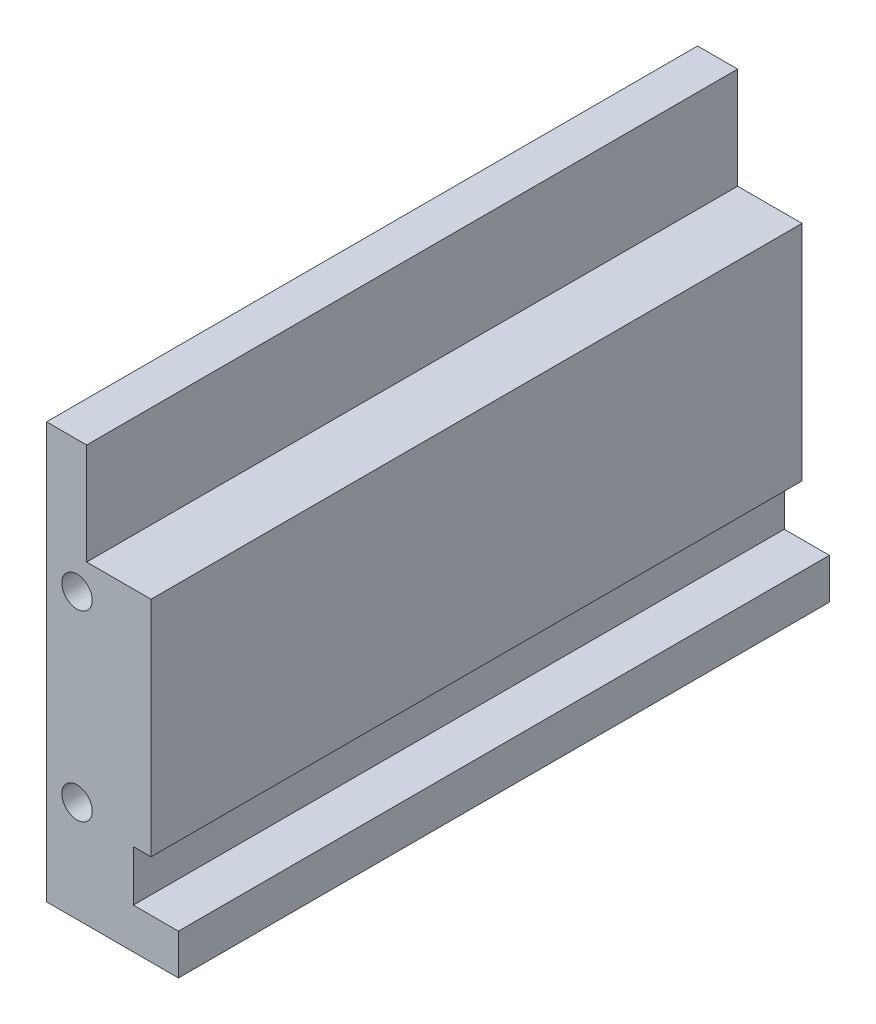
ISO-10303-21;
HEADER;
FILE_DESCRIPTION(('STEP AP214'),'2;1');
FILE_NAME('part.step','',(''),(''),'','','');
FILE_SCHEMA(('AUTOMOTIVE_DESIGN { 1 0 10303 214 1 1 1 1 }'));
ENDSEC;
DATA;
#1=APPLICATION_CONTEXT('core data for automotive mechanical design processes');
#2=APPLICATION_PROTOCOL_DEFINITION('international standard','automotive_design',2000,#1);
#3=PRODUCT_CONTEXT('',#1,'mechanical');
#4=PRODUCT('Part','Part','',(#3));
#5=PRODUCT_RELATED_PRODUCT_CATEGORY('part','',(#4));
#6=PRODUCT_DEFINITION_FORMATION('','',#4);
#7=PRODUCT_DEFINITION_CONTEXT('part definition',#1,'design');
#8=PRODUCT_DEFINITION('design','',#6,#7);
#9=PRODUCT_DEFINITION_SHAPE('','',#8);
#10=(LENGTH_UNIT() NAMED_UNIT(*) SI_UNIT(.MILLI.,.METRE.));
#11=(NAMED_UNIT(*) PLANE_ANGLE_UNIT() SI_UNIT($,.RADIAN.));
#12=(NAMED_UNIT(*) SI_UNIT($,.STERADIAN.) SOLID_ANGLE_UNIT());
#13=UNCERTAINTY_MEASURE_WITH_UNIT(LENGTH_MEASURE(1.E-05),#10,'distance_accuracy_value','');
#14=(GEOMETRIC_REPRESENTATION_CONTEXT(3) GLOBAL_UNCERTAINTY_ASSIGNED_CONTEXT((#13)) GLOBAL_UNIT_ASSIGNED_CONTEXT((#10,
#11,#12)) REPRESENTATION_CONTEXT('',''));
#15=CARTESIAN_POINT('',(0.,0.,0.));
#16=DIRECTION('',(0.,0.,1.));
#17=DIRECTION('',(1.,0.,0.));
#18=AXIS2_PLACEMENT_3D('',#15,#16,#17);
#19=CARTESIAN_POINT('',(13.,0.,64.2));
#20=DIRECTION('',(0.,1.,0.));
#21=DIRECTION('',(-1.,0.,0.));
#22=AXIS2_PLACEMENT_3D('',#19,#20,#21);
#23=PLANE('',#22);
#24=DIRECTION('',(1.,0.,0.));
#25=VECTOR('',#24,1.);
#26=CARTESIAN_POINT('',(13.,0.,0.));
#27=LINE('',#26,#25);
#28=CARTESIAN_POINT('',(0.,0.,0.));
#29=VERTEX_POINT('',#28);
#30=CARTESIAN_POINT('',(13.,0.,0.));
#31=VERTEX_POINT('',#30);
#32=EDGE_CURVE('E151',#29,#31,#27,.T.);
#33=ORIENTED_EDGE('',*,*,#32,.T.);
#34=DIRECTION('',(0.,0.,-1.));
#35=VECTOR('',#34,1.);
#36=CARTESIAN_POINT('',(13.,0.,64.2));
#37=LINE('',#36,#35);
#38=CARTESIAN_POINT('',(13.,0.,64.2));
#39=VERTEX_POINT('',#38);
#40=EDGE_CURVE('E11',#39,#31,#37,.T.);
#41=ORIENTED_EDGE('',*,*,#40,.F.);
#42=DIRECTION('',(1.,0.,0.));
#43=VECTOR('',#42,1.);
#44=CARTESIAN_POINT('',(13.,0.,64.2));
#45=LINE('',#44,#43);
#46=CARTESIAN_POINT('',(0.,0.,64.2));
#47=VERTEX_POINT('',#46);
#48=EDGE_CURVE('E180',#47,#39,#45,.T.);
#49=ORIENTED_EDGE('',*,*,#48,.F.);
#50=DIRECTION('',(0.,0.,-1.));
#51=VECTOR('',#50,1.);
#52=CARTESIAN_POINT('',(0.,0.,64.2));
#53=LINE('',#52,#51);
#54=EDGE_CURVE('E147',#47,#29,#53,.T.);
#55=ORIENTED_EDGE('',*,*,#54,.T.);
#56=EDGE_LOOP('',(#33,#41,#49,#55));
#57=FACE_BOUND('',#56,.T.);
#58=ADVANCED_FACE('F38',(#57),#23,.F.);
#59=CARTESIAN_POINT('',(13.,4.,64.2));
#60=DIRECTION('',(-1.,0.,0.));
#61=DIRECTION('',(0.,-1.,0.));
#62=AXIS2_PLACEMENT_3D('',#59,#60,#61);
#63=PLANE('',#62);
#64=DIRECTION('',(0.,1.,0.));
#65=VECTOR('',#64,1.);
#66=CARTESIAN_POINT('',(13.,4.,0.));
#67=LINE('',#66,#65);
#68=CARTESIAN_POINT('',(13.,4.,0.));
#69=VERTEX_POINT('',#68);
#70=EDGE_CURVE('E155',#31,#69,#67,.T.);
#71=ORIENTED_EDGE('',*,*,#70,.T.);
#72=DIRECTION('',(0.,0.,-1.));
#73=VECTOR('',#72,1.);
#74=CARTESIAN_POINT('',(13.,4.,64.2));
#75=LINE('',#74,#73);
#76=CARTESIAN_POINT('',(13.,4.,64.2));
#77=VERTEX_POINT('',#76);
#78=EDGE_CURVE('E47',#77,#69,#75,.T.);
#79=ORIENTED_EDGE('',*,*,#78,.F.);
#80=DIRECTION('',(0.,1.,0.));
#81=VECTOR('',#80,1.);
#82=CARTESIAN_POINT('',(13.,4.,64.2));
#83=LINE('',#82,#81);
#84=EDGE_CURVE('E104',#39,#77,#83,.T.);
#85=ORIENTED_EDGE('',*,*,#84,.F.);
#86=ORIENTED_EDGE('',*,*,#40,.T.);
#87=EDGE_LOOP('',(#71,#79,#85,#86));
#88=FACE_BOUND('',#87,.T.);
#89=ADVANCED_FACE('F286',(#88),#63,.F.);
#90=CARTESIAN_POINT('',(8.55,4.,64.2));
#91=DIRECTION('',(0.,-1.,0.));
#92=DIRECTION('',(1.,0.,0.));
#93=AXIS2_PLACEMENT_3D('',#90,#91,#92);
#94=PLANE('',#93);
#95=DIRECTION('',(-1.,0.,0.));
#96=VECTOR('',#95,1.);
#97=CARTESIAN_POINT('',(8.55,4.,0.));
#98=LINE('',#97,#96);
#99=CARTESIAN_POINT('',(8.55,4.,0.));
#100=VERTEX_POINT('',#99);
#101=EDGE_CURVE('E159',#69,#100,#98,.T.);
#102=ORIENTED_EDGE('',*,*,#101,.T.);
#103=DIRECTION('',(0.,0.,-1.));
#104=VECTOR('',#103,1.);
#105=CARTESIAN_POINT('',(8.55,4.,64.2));
#106=LINE('',#105,#104);
#107=CARTESIAN_POINT('',(8.55,4.,64.2));
#108=VERTEX_POINT('',#107);
#109=EDGE_CURVE('E199',#108,#100,#106,.T.);
#110=ORIENTED_EDGE('',*,*,#109,.F.);
#111=DIRECTION('',(-1.,0.,0.));
#112=VECTOR('',#111,1.);
#113=CARTESIAN_POINT('',(8.55,4.,64.2));
#114=LINE('',#113,#112);
#115=EDGE_CURVE('E209',#77,#108,#114,.T.);
#116=ORIENTED_EDGE('',*,*,#115,.F.);
#117=ORIENTED_EDGE('',*,*,#78,.T.);
#118=EDGE_LOOP('',(#102,#110,#116,#117));
#119=FACE_BOUND('',#118,.T.);
#120=ADVANCED_FACE('F207',(#119),#94,.F.);
#121=CARTESIAN_POINT('',(8.55,9.,64.2));
#122=DIRECTION('',(-1.,0.,0.));
#123=DIRECTION('',(0.,0.,1.));
#124=AXIS2_PLACEMENT_3D('',#121,#122,#123);
#125=PLANE('',#124);
#126=DIRECTION('',(0.,1.,0.));
#127=VECTOR('',#126,1.);
#128=CARTESIAN_POINT('',(8.55,9.,0.));
#129=LINE('',#128,#127);
#130=CARTESIAN_POINT('',(8.55,9.,0.));
#131=VERTEX_POINT('',#130);
#132=EDGE_CURVE('E162',#100,#131,#129,.T.);
#133=ORIENTED_EDGE('',*,*,#132,.T.);
#134=DIRECTION('',(0.,0.,-1.));
#135=VECTOR('',#134,1.);
#136=CARTESIAN_POINT('',(8.55,9.,64.2));
#137=LINE('',#136,#135);
#138=CARTESIAN_POINT('',(8.55,9.,64.2));
#139=VERTEX_POINT('',#138);
#140=EDGE_CURVE('E195',#139,#131,#137,.T.);
#141=ORIENTED_EDGE('',*,*,#140,.F.);
#142=DIRECTION('',(0.,1.,0.));
#143=VECTOR('',#142,1.);
#144=CARTESIAN_POINT('',(8.55,9.,64.2));
#145=LINE('',#144,#143);
#146=EDGE_CURVE('E228',#108,#139,#145,.T.);
#147=ORIENTED_EDGE('',*,*,#146,.F.);
#148=ORIENTED_EDGE('',*,*,#109,.T.);
#149=EDGE_LOOP('',(#133,#141,#147,#148));
#150=FACE_BOUND('',#149,.T.);
#151=ADVANCED_FACE('F218',(#150),#125,.F.);
#152=CARTESIAN_POINT('',(10.3,9.,64.2));
#153=DIRECTION('',(0.,1.,0.));
#154=DIRECTION('',(0.,0.,1.));
#155=AXIS2_PLACEMENT_3D('',#152,#153,#154);
#156=PLANE('',#155);
#157=DIRECTION('',(1.,0.,0.));
#158=VECTOR('',#157,1.);
#159=CARTESIAN_POINT('',(10.3,9.,0.));
#160=LINE('',#159,#158);
#161=CARTESIAN_POINT('',(10.3,9.,0.));
#162=VERTEX_POINT('',#161);
#163=EDGE_CURVE('E165',#131,#162,#160,.T.);
#164=ORIENTED_EDGE('',*,*,#163,.T.);
#165=DIRECTION('',(0.,0.,-1.));
#166=VECTOR('',#165,1.);
#167=CARTESIAN_POINT('',(10.3,9.,64.2));
#168=LINE('',#167,#166);
#169=CARTESIAN_POINT('',(10.3,9.,64.2));
#170=VERTEX_POINT('',#169);
#171=EDGE_CURVE('E191',#170,#162,#168,.T.);
#172=ORIENTED_EDGE('',*,*,#171,.F.);
#173=DIRECTION('',(1.,0.,0.));
#174=VECTOR('',#173,1.);
#175=CARTESIAN_POINT('',(10.3,9.,64.2));
#176=LINE('',#175,#174);
#177=EDGE_CURVE('E224',#139,#170,#176,.T.);
#178=ORIENTED_EDGE('',*,*,#177,.F.);
#179=ORIENTED_EDGE('',*,*,#140,.T.);
#180=EDGE_LOOP('',(#164,#172,#178,#179));
#181=FACE_BOUND('',#180,.T.);
#182=ADVANCED_FACE('F222',(#181),#156,.F.);
#183=CARTESIAN_POINT('',(10.3,31.,64.2));
#184=DIRECTION('',(-1.,0.,0.));
#185=DIRECTION('',(0.,-1.,0.));
#186=AXIS2_PLACEMENT_3D('',#183,#184,#185);
#187=PLANE('',#186);
#188=DIRECTION('',(0.,1.,0.));
#189=VECTOR('',#188,1.);
#190=CARTESIAN_POINT('',(10.3,31.,0.));
#191=LINE('',#190,#189);
#192=CARTESIAN_POINT('',(10.3,31.,0.));
#193=VERTEX_POINT('',#192);
#194=EDGE_CURVE('E168',#162,#193,#191,.T.);
#195=ORIENTED_EDGE('',*,*,#194,.T.);
#196=DIRECTION('',(0.,0.,-1.));
#197=VECTOR('',#196,1.);
#198=CARTESIAN_POINT('',(10.3,31.,64.2));
#199=LINE('',#198,#197);
#200=CARTESIAN_POINT('',(10.3,31.,64.2));
#201=VERTEX_POINT('',#200);
#202=EDGE_CURVE('E187',#201,#193,#199,.T.);
#203=ORIENTED_EDGE('',*,*,#202,.F.);
#204=DIRECTION('',(0.,1.,0.));
#205=VECTOR('',#204,1.);
#206=CARTESIAN_POINT('',(10.3,31.,64.2));
#207=LINE('',#206,#205);
#208=EDGE_CURVE('E227',#170,#201,#207,.T.);
#209=ORIENTED_EDGE('',*,*,#208,.F.);
#210=ORIENTED_EDGE('',*,*,#171,.T.);
#211=EDGE_LOOP('',(#195,#203,#209,#210));
#212=FACE_BOUND('',#211,.T.);
#213=ADVANCED_FACE('F298',(#212),#187,.F.);
#214=CARTESIAN_POINT('',(3.95,31.,64.2));
#215=DIRECTION('',(0.,-1.,0.));
#216=DIRECTION('',(0.,0.,-1.));
#217=AXIS2_PLACEMENT_3D('',#214,#215,#216);
#218=PLANE('',#217);
#219=DIRECTION('',(-1.,0.,0.));
#220=VECTOR('',#219,1.);
#221=CARTESIAN_POINT('',(3.95,31.,0.));
#222=LINE('',#221,#220);
#223=CARTESIAN_POINT('',(3.95,31.,0.));
#224=VERTEX_POINT('',#223);
#225=EDGE_CURVE('E171',#193,#224,#222,.T.);
#226=ORIENTED_EDGE('',*,*,#225,.T.);
#227=DIRECTION('',(0.,0.,-1.));
#228=VECTOR('',#227,1.);
#229=CARTESIAN_POINT('',(3.95,31.,64.2));
#230=LINE('',#229,#228);
#231=CARTESIAN_POINT('',(3.95,31.,64.2));
#232=VERTEX_POINT('',#231);
#233=EDGE_CURVE('E140',#232,#224,#230,.T.);
#234=ORIENTED_EDGE('',*,*,#233,.F.);
#235=DIRECTION('',(-1.,0.,0.));
#236=VECTOR('',#235,1.);
#237=CARTESIAN_POINT('',(3.95,31.,64.2));
#238=LINE('',#237,#236);
#239=EDGE_CURVE('E129',#201,#232,#238,.T.);
#240=ORIENTED_EDGE('',*,*,#239,.F.);
#241=ORIENTED_EDGE('',*,*,#202,.T.);
#242=EDGE_LOOP('',(#226,#234,#240,#241));
#243=FACE_BOUND('',#242,.T.);
#244=ADVANCED_FACE('F295',(#243),#218,.F.);
#245=CARTESIAN_POINT('',(3.94999999999999,41.,64.2));
#246=DIRECTION('',(-1.,0.,0.));
#247=DIRECTION('',(0.,-1.,0.));
#248=AXIS2_PLACEMENT_3D('',#245,#246,#247);
#249=PLANE('',#248);
#250=DIRECTION('',(0.,1.,0.));
#251=VECTOR('',#250,1.);
#252=CARTESIAN_POINT('',(3.94999999999999,41.,0.));
#253=LINE('',#252,#251);
#254=CARTESIAN_POINT('',(3.94999999999999,41.,0.));
#255=VERTEX_POINT('',#254);
#256=EDGE_CURVE('E138',#224,#255,#253,.T.);
#257=ORIENTED_EDGE('',*,*,#256,.T.);
#258=DIRECTION('',(0.,0.,-1.));
#259=VECTOR('',#258,1.);
#260=CARTESIAN_POINT('',(3.94999999999999,41.,64.2));
#261=LINE('',#260,#259);
#262=CARTESIAN_POINT('',(3.94999999999999,41.,64.2));
#263=VERTEX_POINT('',#262);
#264=EDGE_CURVE('E135',#263,#255,#261,.T.);
#265=ORIENTED_EDGE('',*,*,#264,.F.);
#266=DIRECTION('',(0.,1.,0.));
#267=VECTOR('',#266,1.);
#268=CARTESIAN_POINT('',(3.94999999999999,41.,64.2));
#269=LINE('',#268,#267);
#270=EDGE_CURVE('E123',#232,#263,#269,.T.);
#271=ORIENTED_EDGE('',*,*,#270,.F.);
#272=ORIENTED_EDGE('',*,*,#233,.T.);
#273=EDGE_LOOP('',(#257,#265,#271,#272));
#274=FACE_BOUND('',#273,.T.);
#275=ADVANCED_FACE('F136',(#274),#249,.F.);
#276=CARTESIAN_POINT('',(0.,41.,64.2));
#277=DIRECTION('',(0.,-1.,0.));
#278=DIRECTION('',(0.,0.,-1.));
#279=AXIS2_PLACEMENT_3D('',#276,#277,#278);
#280=PLANE('',#279);
#281=DIRECTION('',(-1.,0.,0.));
#282=VECTOR('',#281,1.);
#283=CARTESIAN_POINT('',(0.,41.,0.));
#284=LINE('',#283,#282);
#285=CARTESIAN_POINT('',(0.,41.,0.));
#286=VERTEX_POINT('',#285);
#287=EDGE_CURVE('E90',#255,#286,#284,.T.);
#288=ORIENTED_EDGE('',*,*,#287,.T.);
#289=DIRECTION('',(0.,0.,-1.));
#290=VECTOR('',#289,1.);
#291=CARTESIAN_POINT('',(0.,41.,64.2));
#292=LINE('',#291,#290);
#293=CARTESIAN_POINT('',(0.,41.,64.2));
#294=VERTEX_POINT('',#293);
#295=EDGE_CURVE('E141',#294,#286,#292,.T.);
#296=ORIENTED_EDGE('',*,*,#295,.F.);
#297=DIRECTION('',(-1.,0.,0.));
#298=VECTOR('',#297,1.);
#299=CARTESIAN_POINT('',(0.,41.,64.2));
#300=LINE('',#299,#298);
#301=EDGE_CURVE('E127',#263,#294,#300,.T.);
#302=ORIENTED_EDGE('',*,*,#301,.F.);
#303=ORIENTED_EDGE('',*,*,#264,.T.);
#304=EDGE_LOOP('',(#288,#296,#302,#303));
#305=FACE_BOUND('',#304,.T.);
#306=ADVANCED_FACE('F143',(#305),#280,.F.);
#307=CARTESIAN_POINT('',(0.,0.,64.2));
#308=DIRECTION('',(1.,0.,0.));
#309=DIRECTION('',(0.,0.,-1.));
#310=AXIS2_PLACEMENT_3D('',#307,#308,#309);
#311=PLANE('',#310);
#312=DIRECTION('',(0.,-1.,0.));
#313=VECTOR('',#312,1.);
#314=CARTESIAN_POINT('',(0.,0.,0.));
#315=LINE('',#314,#313);
#316=EDGE_CURVE('E96',#286,#29,#315,.T.);
#317=ORIENTED_EDGE('',*,*,#316,.T.);
#318=ORIENTED_EDGE('',*,*,#54,.F.);
#319=DIRECTION('',(0.,-1.,0.));
#320=VECTOR('',#319,1.);
#321=CARTESIAN_POINT('',(0.,0.,64.2));
#322=LINE('',#321,#320);
#323=EDGE_CURVE('E55',#294,#47,#322,.T.);
#324=ORIENTED_EDGE('',*,*,#323,.F.);
#325=ORIENTED_EDGE('',*,*,#295,.T.);
#326=EDGE_LOOP('',(#317,#318,#324,#325));
#327=FACE_BOUND('',#326,.T.);
#328=ADVANCED_FACE('F350',(#327),#311,.F.);
#329=CARTESIAN_POINT('',(0.,0.,64.2));
#330=DIRECTION('',(0.,0.,-1.));
#331=DIRECTION('',(-1.,0.,0.));
#332=AXIS2_PLACEMENT_3D('',#329,#330,#331);
#333=PLANE('',#332);
#334=CARTESIAN_POINT('',(3.,28.,64.2));
#335=DIRECTION('',(0.,0.,1.));
#336=DIRECTION('',(1.,0.,0.));
#337=AXIS2_PLACEMENT_3D('',#334,#335,#336);
#338=CIRCLE('',#337,1.5);
#339=CARTESIAN_POINT('',(4.5,28.,64.2));
#340=VERTEX_POINT('',#339);
#341=EDGE_CURVE('E251',#340,#340,#338,.T.);
#342=ORIENTED_EDGE('',*,*,#341,.F.);
#343=EDGE_LOOP('',(#342));
#344=FACE_BOUND('',#343,.T.);
#345=CARTESIAN_POINT('',(3.,10.,64.2));
#346=DIRECTION('',(0.,0.,1.));
#347=DIRECTION('',(1.,0.,0.));
#348=AXIS2_PLACEMENT_3D('',#345,#346,#347);
#349=CIRCLE('',#348,1.5);
#350=CARTESIAN_POINT('',(4.5,10.,64.2));
#351=VERTEX_POINT('',#350);
#352=EDGE_CURVE('E242',#351,#351,#349,.T.);
#353=ORIENTED_EDGE('',*,*,#352,.F.);
#354=EDGE_LOOP('',(#353));
#355=FACE_BOUND('',#354,.T.);
#356=ORIENTED_EDGE('',*,*,#48,.T.);
#357=ORIENTED_EDGE('',*,*,#84,.T.);
#358=ORIENTED_EDGE('',*,*,#115,.T.);
#359=ORIENTED_EDGE('',*,*,#146,.T.);
#360=ORIENTED_EDGE('',*,*,#177,.T.);
#361=ORIENTED_EDGE('',*,*,#208,.T.);
#362=ORIENTED_EDGE('',*,*,#239,.T.);
#363=ORIENTED_EDGE('',*,*,#270,.T.);
#364=ORIENTED_EDGE('',*,*,#301,.T.);
#365=ORIENTED_EDGE('',*,*,#323,.T.);
#366=EDGE_LOOP('',(#356,#357,#358,#359,#360,#361,#362,#363,#364,#365));
#367=FACE_BOUND('',#366,.T.);
#368=ADVANCED_FACE('F125',(#344,#355,#367),#333,.F.);
#369=CARTESIAN_POINT('',(0.,0.,0.));
#370=DIRECTION('',(0.,0.,-1.));
#371=DIRECTION('',(-1.,0.,0.));
#372=AXIS2_PLACEMENT_3D('',#369,#370,#371);
#373=PLANE('',#372);
#374=CARTESIAN_POINT('',(3.,28.,0.));
#375=DIRECTION('',(0.,0.,1.));
#376=DIRECTION('',(1.,0.,0.));
#377=AXIS2_PLACEMENT_3D('',#374,#375,#376);
#378=CIRCLE('',#377,1.5);
#379=CARTESIAN_POINT('',(4.5,28.,0.));
#380=VERTEX_POINT('',#379);
#381=EDGE_CURVE('E266',#380,#380,#378,.T.);
#382=ORIENTED_EDGE('',*,*,#381,.T.);
#383=EDGE_LOOP('',(#382));
#384=FACE_BOUND('',#383,.T.);
#385=CARTESIAN_POINT('',(3.,10.,0.));
#386=DIRECTION('',(0.,0.,1.));
#387=DIRECTION('',(1.,0.,0.));
#388=AXIS2_PLACEMENT_3D('',#385,#386,#387);
#389=CIRCLE('',#388,1.5);
#390=CARTESIAN_POINT('',(4.5,10.,0.));
#391=VERTEX_POINT('',#390);
#392=EDGE_CURVE('E258',#391,#391,#389,.T.);
#393=ORIENTED_EDGE('',*,*,#392,.T.);
#394=EDGE_LOOP('',(#393));
#395=FACE_BOUND('',#394,.T.);
#396=ORIENTED_EDGE('',*,*,#32,.F.);
#397=ORIENTED_EDGE('',*,*,#316,.F.);
#398=ORIENTED_EDGE('',*,*,#287,.F.);
#399=ORIENTED_EDGE('',*,*,#256,.F.);
#400=ORIENTED_EDGE('',*,*,#225,.F.);
#401=ORIENTED_EDGE('',*,*,#194,.F.);
#402=ORIENTED_EDGE('',*,*,#163,.F.);
#403=ORIENTED_EDGE('',*,*,#132,.F.);
#404=ORIENTED_EDGE('',*,*,#101,.F.);
#405=ORIENTED_EDGE('',*,*,#70,.F.);
#406=EDGE_LOOP('',(#396,#397,#398,#399,#400,#401,#402,#403,#404,#405));
#407=FACE_BOUND('',#406,.T.);
#408=ADVANCED_FACE('F213',(#384,#395,#407),#373,.T.);
#409=CARTESIAN_POINT('',(3.,10.,59.2));
#410=DIRECTION('',(0.,0.,1.));
#411=DIRECTION('',(1.,0.,0.));
#412=AXIS2_PLACEMENT_3D('',#409,#410,#411);
#413=CYLINDRICAL_SURFACE('',#412,1.5);
#414=CARTESIAN_POINT('',(3.,10.,59.2));
#415=DIRECTION('',(0.,0.,1.));
#416=DIRECTION('',(1.,0.,0.));
#417=AXIS2_PLACEMENT_3D('',#414,#415,#416);
#418=CIRCLE('',#417,1.5);
#419=CARTESIAN_POINT('',(4.5,10.,59.2));
#420=VERTEX_POINT('',#419);
#421=EDGE_CURVE('E246',#420,#420,#418,.T.);
#422=ORIENTED_EDGE('',*,*,#421,.F.);
#423=EDGE_LOOP('',(#422));
#424=FACE_BOUND('',#423,.T.);
#425=ORIENTED_EDGE('',*,*,#352,.T.);
#426=EDGE_LOOP('',(#425));
#427=FACE_BOUND('',#426,.T.);
#428=ADVANCED_FACE('F371',(#424,#427),#413,.F.);
#429=CARTESIAN_POINT('',(3.,10.,59.2));
#430=DIRECTION('',(0.,0.,1.));
#431=DIRECTION('',(1.,0.,0.));
#432=AXIS2_PLACEMENT_3D('',#429,#430,#431);
#433=PLANE('',#432);
#434=ORIENTED_EDGE('',*,*,#421,.T.);
#435=EDGE_LOOP('',(#434));
#436=FACE_BOUND('',#435,.T.);
#437=ADVANCED_FACE('F376',(#436),#433,.T.);
#438=CARTESIAN_POINT('',(3.,28.,59.2));
#439=DIRECTION('',(0.,0.,1.));
#440=DIRECTION('',(1.,0.,0.));
#441=AXIS2_PLACEMENT_3D('',#438,#439,#440);
#442=CYLINDRICAL_SURFACE('',#441,1.5);
#443=CARTESIAN_POINT('',(3.,28.,59.2));
#444=DIRECTION('',(0.,0.,1.));
#445=DIRECTION('',(1.,0.,0.));
#446=AXIS2_PLACEMENT_3D('',#443,#444,#445);
#447=CIRCLE('',#446,1.5);
#448=CARTESIAN_POINT('',(4.5,28.,59.2));
#449=VERTEX_POINT('',#448);
#450=EDGE_CURVE('E156',#449,#449,#447,.T.);
#451=ORIENTED_EDGE('',*,*,#450,.F.);
#452=EDGE_LOOP('',(#451));
#453=FACE_BOUND('',#452,.T.);
#454=ORIENTED_EDGE('',*,*,#341,.T.);
#455=EDGE_LOOP('',(#454));
#456=FACE_BOUND('',#455,.T.);
#457=ADVANCED_FACE('F387',(#453,#456),#442,.F.);
#458=CARTESIAN_POINT('',(3.,28.,59.2));
#459=DIRECTION('',(0.,0.,1.));
#460=DIRECTION('',(1.,0.,0.));
#461=AXIS2_PLACEMENT_3D('',#458,#459,#460);
#462=PLANE('',#461);
#463=ORIENTED_EDGE('',*,*,#450,.T.);
#464=EDGE_LOOP('',(#463));
#465=FACE_BOUND('',#464,.T.);
#466=ADVANCED_FACE('F397',(#465),#462,.T.);
#467=CARTESIAN_POINT('',(3.,10.,5.));
#468=DIRECTION('',(0.,0.,-1.));
#469=DIRECTION('',(-1.,0.,0.));
#470=AXIS2_PLACEMENT_3D('',#467,#468,#469);
#471=CYLINDRICAL_SURFACE('',#470,1.5);
#472=CARTESIAN_POINT('',(3.,10.,5.));
#473=DIRECTION('',(0.,0.,1.));
#474=DIRECTION('',(1.,0.,0.));
#475=AXIS2_PLACEMENT_3D('',#472,#473,#474);
#476=CIRCLE('',#475,1.5);
#477=CARTESIAN_POINT('',(4.5,10.,5.));
#478=VERTEX_POINT('',#477);
#479=EDGE_CURVE('E262',#478,#478,#476,.T.);
#480=ORIENTED_EDGE('',*,*,#479,.T.);
#481=EDGE_LOOP('',(#480));
#482=FACE_BOUND('',#481,.T.);
#483=ORIENTED_EDGE('',*,*,#392,.F.);
#484=EDGE_LOOP('',(#483));
#485=FACE_BOUND('',#484,.T.);
#486=ADVANCED_FACE('F407',(#482,#485),#471,.F.);
#487=CARTESIAN_POINT('',(3.,10.,5.));
#488=DIRECTION('',(0.,0.,-1.));
#489=DIRECTION('',(1.,0.,0.));
#490=AXIS2_PLACEMENT_3D('',#487,#488,#489);
#491=PLANE('',#490);
#492=ORIENTED_EDGE('',*,*,#479,.F.);
#493=EDGE_LOOP('',(#492));
#494=FACE_BOUND('',#493,.T.);
#495=ADVANCED_FACE('F283',(#494),#491,.T.);
#496=CARTESIAN_POINT('',(3.,28.,5.));
#497=DIRECTION('',(0.,0.,-1.));
#498=DIRECTION('',(-1.,0.,0.));
#499=AXIS2_PLACEMENT_3D('',#496,#497,#498);
#500=CYLINDRICAL_SURFACE('',#499,1.5);
#501=CARTESIAN_POINT('',(3.,28.,5.));
#502=DIRECTION('',(0.,0.,1.));
#503=DIRECTION('',(1.,0.,0.));
#504=AXIS2_PLACEMENT_3D('',#501,#502,#503);
#505=CIRCLE('',#504,1.5);
#506=CARTESIAN_POINT('',(4.5,28.,5.));
#507=VERTEX_POINT('',#506);
#508=EDGE_CURVE('E247',#507,#507,#505,.T.);
#509=ORIENTED_EDGE('',*,*,#508,.T.);
#510=EDGE_LOOP('',(#509));
#511=FACE_BOUND('',#510,.T.);
#512=ORIENTED_EDGE('',*,*,#381,.F.);
#513=EDGE_LOOP('',(#512));
#514=FACE_BOUND('',#513,.T.);
#515=ADVANCED_FACE('F274',(#511,#514),#500,.F.);
#516=CARTESIAN_POINT('',(3.,28.,5.));
#517=DIRECTION('',(0.,0.,-1.));
#518=DIRECTION('',(1.,0.,0.));
#519=AXIS2_PLACEMENT_3D('',#516,#517,#518);
#520=PLANE('',#519);
#521=ORIENTED_EDGE('',*,*,#508,.F.);
#522=EDGE_LOOP('',(#521));
#523=FACE_BOUND('',#522,.T.);
#524=ADVANCED_FACE('F277',(#523),#520,.T.);
#525=CLOSED_SHELL('',(#58,#89,#120,#151,#182,#213,#244,#275,#306,#328,#368,#408,#428,#437,#457,
#466,#486,#495,#515,#524));
#526=MANIFOLD_SOLID_BREP('B2',#525);
#527=ADVANCED_BREP_SHAPE_REPRESENTATION('',(#18,#526),#14);
#528=SHAPE_DEFINITION_REPRESENTATION(#9,#527);
ENDSEC;
END-ISO-10303-21;
